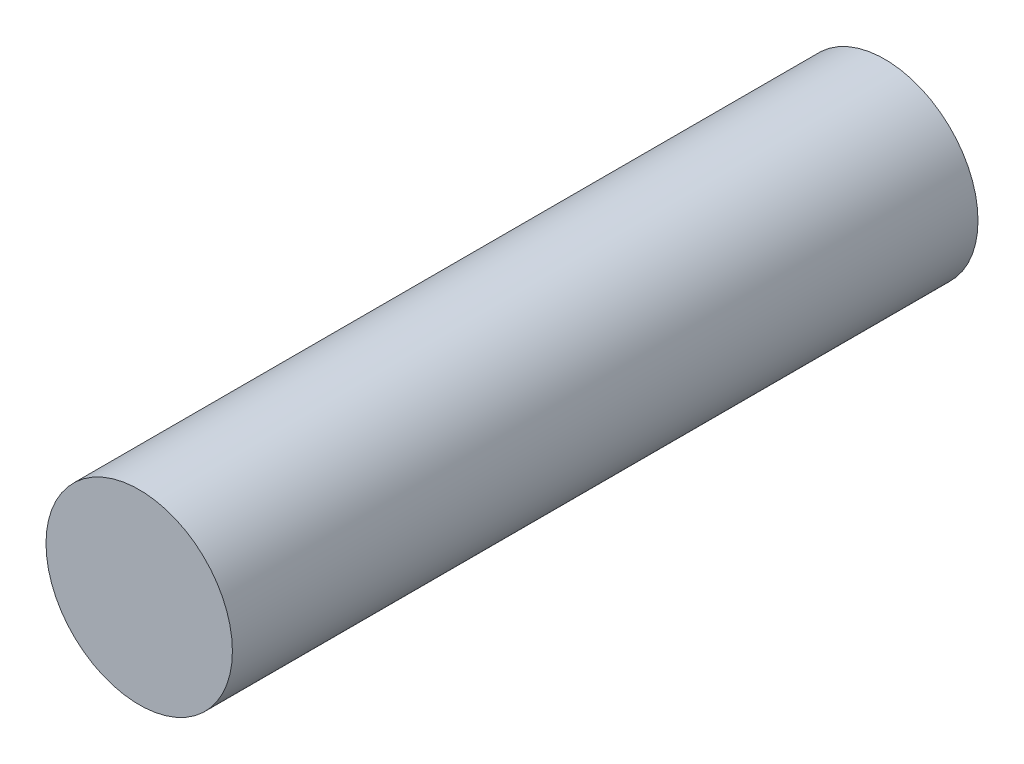
ISO-10303-21;
HEADER;
FILE_DESCRIPTION(('STEP AP214'),'2;1');
FILE_NAME('part.step','',(''),(''),'','','');
FILE_SCHEMA(('AUTOMOTIVE_DESIGN { 1 0 10303 214 1 1 1 1 }'));
ENDSEC;
DATA;
#1=APPLICATION_CONTEXT('core data for automotive mechanical design processes');
#2=APPLICATION_PROTOCOL_DEFINITION('international standard','automotive_design',2000,#1);
#3=PRODUCT_CONTEXT('',#1,'mechanical');
#4=PRODUCT('Part','Part','',(#3));
#5=PRODUCT_RELATED_PRODUCT_CATEGORY('part','',(#4));
#6=PRODUCT_DEFINITION_FORMATION('','',#4);
#7=PRODUCT_DEFINITION_CONTEXT('part definition',#1,'design');
#8=PRODUCT_DEFINITION('design','',#6,#7);
#9=PRODUCT_DEFINITION_SHAPE('','',#8);
#10=(LENGTH_UNIT() NAMED_UNIT(*) SI_UNIT(.MILLI.,.METRE.));
#11=(NAMED_UNIT(*) PLANE_ANGLE_UNIT() SI_UNIT($,.RADIAN.));
#12=(NAMED_UNIT(*) SI_UNIT($,.STERADIAN.) SOLID_ANGLE_UNIT());
#13=UNCERTAINTY_MEASURE_WITH_UNIT(LENGTH_MEASURE(1.E-05),#10,'distance_accuracy_value','');
#14=(GEOMETRIC_REPRESENTATION_CONTEXT(3) GLOBAL_UNCERTAINTY_ASSIGNED_CONTEXT((#13)) GLOBAL_UNIT_ASSIGNED_CONTEXT((#10,
#11,#12)) REPRESENTATION_CONTEXT('',''));
#15=CARTESIAN_POINT('',(0.,0.,0.));
#16=DIRECTION('',(0.,0.,1.));
#17=DIRECTION('',(1.,0.,0.));
#18=AXIS2_PLACEMENT_3D('',#15,#16,#17);
#19=CARTESIAN_POINT('',(0.,0.,24.));
#20=DIRECTION('',(0.,0.,-1.));
#21=DIRECTION('',(-1.,0.,0.));
#22=AXIS2_PLACEMENT_3D('',#19,#20,#21);
#23=CYLINDRICAL_SURFACE('',#22,3.);
#24=CARTESIAN_POINT('',(0.,0.,24.));
#25=DIRECTION('',(0.,0.,1.));
#26=DIRECTION('',(1.,0.,0.));
#27=AXIS2_PLACEMENT_3D('',#24,#25,#26);
#28=CIRCLE('',#27,3.);
#29=CARTESIAN_POINT('',(3.,0.,24.));
#30=VERTEX_POINT('',#29);
#31=EDGE_CURVE('E10',#30,#30,#28,.T.);
#32=ORIENTED_EDGE('',*,*,#31,.F.);
#33=EDGE_LOOP('',(#32));
#34=FACE_BOUND('',#33,.T.);
#35=CARTESIAN_POINT('',(0.,0.,0.));
#36=DIRECTION('',(0.,0.,1.));
#37=DIRECTION('',(1.,0.,0.));
#38=AXIS2_PLACEMENT_3D('',#35,#36,#37);
#39=CIRCLE('',#38,3.);
#40=CARTESIAN_POINT('',(3.,0.,0.));
#41=VERTEX_POINT('',#40);
#42=EDGE_CURVE('E40',#41,#41,#39,.T.);
#43=ORIENTED_EDGE('',*,*,#42,.T.);
#44=EDGE_LOOP('',(#43));
#45=FACE_BOUND('',#44,.T.);
#46=ADVANCED_FACE('F37',(#34,#45),#23,.T.);
#47=CARTESIAN_POINT('',(0.,0.,24.));
#48=DIRECTION('',(0.,0.,1.));
#49=DIRECTION('',(1.,0.,0.));
#50=AXIS2_PLACEMENT_3D('',#47,#48,#49);
#51=PLANE('',#50);
#52=ORIENTED_EDGE('',*,*,#31,.T.);
#53=EDGE_LOOP('',(#52));
#54=FACE_BOUND('',#53,.T.);
#55=ADVANCED_FACE('F54',(#54),#51,.T.);
#56=CARTESIAN_POINT('',(0.,0.,0.));
#57=DIRECTION('',(0.,0.,1.));
#58=DIRECTION('',(1.,0.,0.));
#59=AXIS2_PLACEMENT_3D('',#56,#57,#58);
#60=PLANE('',#59);
#61=ORIENTED_EDGE('',*,*,#42,.F.);
#62=EDGE_LOOP('',(#61));
#63=FACE_BOUND('',#62,.T.);
#64=ADVANCED_FACE('F52',(#63),#60,.F.);
#65=CLOSED_SHELL('',(#46,#55,#64));
#66=MANIFOLD_SOLID_BREP('B2',#65);
#67=ADVANCED_BREP_SHAPE_REPRESENTATION('',(#18,#66),#14);
#68=SHAPE_DEFINITION_REPRESENTATION(#9,#67);
ENDSEC;
END-ISO-10303-21;
